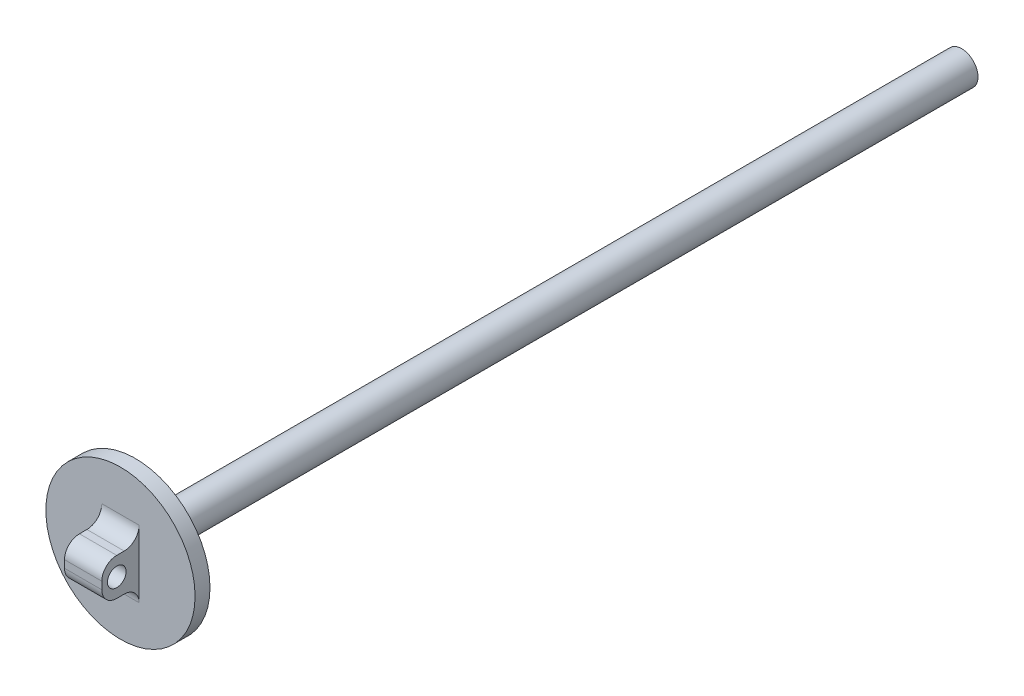
ISO-10303-21;
HEADER;
FILE_DESCRIPTION(('STEP AP214'),'2;1');
FILE_NAME('part.step','',(''),(''),'','','');
FILE_SCHEMA(('AUTOMOTIVE_DESIGN { 1 0 10303 214 1 1 1 1 }'));
ENDSEC;
DATA;
#1=APPLICATION_CONTEXT('core data for automotive mechanical design processes');
#2=APPLICATION_PROTOCOL_DEFINITION('international standard','automotive_design',2000,#1);
#3=PRODUCT_CONTEXT('',#1,'mechanical');
#4=PRODUCT('Part','Part','',(#3));
#5=PRODUCT_RELATED_PRODUCT_CATEGORY('part','',(#4));
#6=PRODUCT_DEFINITION_FORMATION('','',#4);
#7=PRODUCT_DEFINITION_CONTEXT('part definition',#1,'design');
#8=PRODUCT_DEFINITION('design','',#6,#7);
#9=PRODUCT_DEFINITION_SHAPE('','',#8);
#10=(LENGTH_UNIT() NAMED_UNIT(*) SI_UNIT(.MILLI.,.METRE.));
#11=(NAMED_UNIT(*) PLANE_ANGLE_UNIT() SI_UNIT($,.RADIAN.));
#12=(NAMED_UNIT(*) SI_UNIT($,.STERADIAN.) SOLID_ANGLE_UNIT());
#13=UNCERTAINTY_MEASURE_WITH_UNIT(LENGTH_MEASURE(1.E-05),#10,'distance_accuracy_value','');
#14=(GEOMETRIC_REPRESENTATION_CONTEXT(3) GLOBAL_UNCERTAINTY_ASSIGNED_CONTEXT((#13)) GLOBAL_UNIT_ASSIGNED_CONTEXT((#10,
#11,#12)) REPRESENTATION_CONTEXT('',''));
#15=CARTESIAN_POINT('',(0.,0.,0.));
#16=DIRECTION('',(0.,0.,1.));
#17=DIRECTION('',(1.,0.,0.));
#18=AXIS2_PLACEMENT_3D('',#15,#16,#17);
#19=CARTESIAN_POINT('',(0.,0.,547.37));
#20=DIRECTION('',(0.,0.,1.));
#21=DIRECTION('',(1.,0.,0.));
#22=AXIS2_PLACEMENT_3D('',#19,#20,#21);
#23=CYLINDRICAL_SURFACE('',#22,12.2616782014535);
#24=CARTESIAN_POINT('',(0.,0.,547.37));
#25=DIRECTION('',(0.,0.,1.));
#26=DIRECTION('',(1.,0.,0.));
#27=AXIS2_PLACEMENT_3D('',#24,#25,#26);
#28=CIRCLE('',#27,12.2616782014535);
#29=CARTESIAN_POINT('',(12.2616782014535,0.,547.37));
#30=VERTEX_POINT('',#29);
#31=EDGE_CURVE('E240',#30,#30,#28,.T.);
#32=ORIENTED_EDGE('',*,*,#31,.T.);
#33=EDGE_LOOP('',(#32));
#34=FACE_BOUND('',#33,.T.);
#35=CARTESIAN_POINT('',(0.,0.,562.61));
#36=DIRECTION('',(0.,0.,1.));
#37=DIRECTION('',(1.,0.,0.));
#38=AXIS2_PLACEMENT_3D('',#35,#36,#37);
#39=CIRCLE('',#38,12.2616782014535);
#40=CARTESIAN_POINT('',(12.2616782014535,0.,562.61));
#41=VERTEX_POINT('',#40);
#42=EDGE_CURVE('E170',#41,#41,#39,.F.);
#43=ORIENTED_EDGE('',*,*,#42,.T.);
#44=EDGE_LOOP('',(#43));
#45=FACE_BOUND('',#44,.T.);
#46=ADVANCED_FACE('F62',(#34,#45),#23,.T.);
#47=CARTESIAN_POINT('',(0.,0.,572.77));
#48=DIRECTION('',(0.,0.,-1.));
#49=DIRECTION('',(-1.,0.,0.));
#50=AXIS2_PLACEMENT_3D('',#47,#48,#49);
#51=CYLINDRICAL_SURFACE('',#50,11.1125);
#52=CARTESIAN_POINT('',(0.,0.,0.));
#53=DIRECTION('',(0.,0.,1.));
#54=DIRECTION('',(1.,0.,0.));
#55=AXIS2_PLACEMENT_3D('',#52,#53,#54);
#56=CIRCLE('',#55,11.1125);
#57=CARTESIAN_POINT('',(11.1125,0.,0.));
#58=VERTEX_POINT('',#57);
#59=EDGE_CURVE('E165',#58,#58,#56,.T.);
#60=ORIENTED_EDGE('',*,*,#59,.T.);
#61=EDGE_LOOP('',(#60));
#62=FACE_BOUND('',#61,.T.);
#63=CARTESIAN_POINT('',(0.,0.,547.37));
#64=DIRECTION('',(0.,0.,1.));
#65=DIRECTION('',(1.,0.,0.));
#66=AXIS2_PLACEMENT_3D('',#63,#64,#65);
#67=CIRCLE('',#66,11.1125);
#68=CARTESIAN_POINT('',(11.1125,0.,547.37));
#69=VERTEX_POINT('',#68);
#70=EDGE_CURVE('E156',#69,#69,#67,.T.);
#71=ORIENTED_EDGE('',*,*,#70,.F.);
#72=EDGE_LOOP('',(#71));
#73=FACE_BOUND('',#72,.T.);
#74=ADVANCED_FACE('F284',(#62,#73),#51,.T.);
#75=CARTESIAN_POINT('',(0.,0.,0.));
#76=DIRECTION('',(0.,0.,1.));
#77=DIRECTION('',(1.,0.,0.));
#78=AXIS2_PLACEMENT_3D('',#75,#76,#77);
#79=PLANE('',#78);
#80=ORIENTED_EDGE('',*,*,#59,.F.);
#81=EDGE_LOOP('',(#80));
#82=FACE_BOUND('',#81,.T.);
#83=ADVANCED_FACE('F292',(#82),#79,.F.);
#84=CARTESIAN_POINT('',(0.,0.,547.37));
#85=DIRECTION('',(0.,0.,1.));
#86=DIRECTION('',(1.,0.,0.));
#87=AXIS2_PLACEMENT_3D('',#84,#85,#86);
#88=PLANE('',#87);
#89=ORIENTED_EDGE('',*,*,#70,.T.);
#90=EDGE_LOOP('',(#89));
#91=FACE_BOUND('',#90,.T.);
#92=ORIENTED_EDGE('',*,*,#31,.F.);
#93=EDGE_LOOP('',(#92));
#94=FACE_BOUND('',#93,.T.);
#95=ADVANCED_FACE('F300',(#91,#94),#88,.F.);
#96=CARTESIAN_POINT('',(0.,0.,572.77));
#97=DIRECTION('',(0.,0.,1.));
#98=DIRECTION('',(1.,0.,0.));
#99=AXIS2_PLACEMENT_3D('',#96,#97,#98);
#100=PLANE('',#99);
#101=CARTESIAN_POINT('',(0.,0.,572.77));
#102=DIRECTION('',(0.,0.,1.));
#103=DIRECTION('',(1.,0.,0.));
#104=AXIS2_PLACEMENT_3D('',#101,#102,#103);
#105=CIRCLE('',#104,50.8);
#106=CARTESIAN_POINT('',(50.8,0.,572.77));
#107=VERTEX_POINT('',#106);
#108=EDGE_CURVE('E256',#107,#107,#105,.T.);
#109=ORIENTED_EDGE('',*,*,#108,.T.);
#110=EDGE_LOOP('',(#109));
#111=FACE_BOUND('',#110,.T.);
#112=DIRECTION('',(0.,1.,0.));
#113=VECTOR('',#112,1.);
#114=CARTESIAN_POINT('',(12.6999999999999,12.7,572.77));
#115=LINE('',#114,#113);
#116=CARTESIAN_POINT('',(12.7,-22.86,572.77));
#117=VERTEX_POINT('',#116);
#118=CARTESIAN_POINT('',(12.7,22.86,572.77));
#119=VERTEX_POINT('',#118);
#120=EDGE_CURVE('E217',#117,#119,#115,.T.);
#121=ORIENTED_EDGE('',*,*,#120,.F.);
#122=DIRECTION('',(1.,0.,0.));
#123=VECTOR('',#122,1.);
#124=CARTESIAN_POINT('',(0.,-22.86,572.77));
#125=LINE('',#124,#123);
#126=CARTESIAN_POINT('',(-12.7,-22.86,572.77));
#127=VERTEX_POINT('',#126);
#128=EDGE_CURVE('E173',#117,#127,#125,.F.);
#129=ORIENTED_EDGE('',*,*,#128,.T.);
#130=DIRECTION('',(0.,-1.,0.));
#131=VECTOR('',#130,1.);
#132=CARTESIAN_POINT('',(-12.7000000000001,12.7,572.77));
#133=LINE('',#132,#131);
#134=CARTESIAN_POINT('',(-12.7,22.8599999999999,572.77));
#135=VERTEX_POINT('',#134);
#136=EDGE_CURVE('E210',#135,#127,#133,.T.);
#137=ORIENTED_EDGE('',*,*,#136,.F.);
#138=DIRECTION('',(-1.,0.,0.));
#139=VECTOR('',#138,1.);
#140=CARTESIAN_POINT('',(0.,22.86,572.77));
#141=LINE('',#140,#139);
#142=EDGE_CURVE('E163',#135,#119,#141,.F.);
#143=ORIENTED_EDGE('',*,*,#142,.T.);
#144=EDGE_LOOP('',(#121,#129,#137,#143));
#145=FACE_BOUND('',#144,.T.);
#146=ADVANCED_FACE('F213',(#111,#145),#100,.T.);
#147=CARTESIAN_POINT('',(0.,0.,562.61));
#148=DIRECTION('',(0.,0.,1.));
#149=DIRECTION('',(1.,0.,0.));
#150=AXIS2_PLACEMENT_3D('',#147,#148,#149);
#151=CYLINDRICAL_SURFACE('',#150,50.8);
#152=CARTESIAN_POINT('',(0.,0.,562.61));
#153=DIRECTION('',(0.,0.,1.));
#154=DIRECTION('',(1.,0.,0.));
#155=AXIS2_PLACEMENT_3D('',#152,#153,#154);
#156=CIRCLE('',#155,50.8);
#157=CARTESIAN_POINT('',(50.8,0.,562.61));
#158=VERTEX_POINT('',#157);
#159=EDGE_CURVE('E260',#158,#158,#156,.T.);
#160=ORIENTED_EDGE('',*,*,#159,.T.);
#161=EDGE_LOOP('',(#160));
#162=FACE_BOUND('',#161,.T.);
#163=ORIENTED_EDGE('',*,*,#108,.F.);
#164=EDGE_LOOP('',(#163));
#165=FACE_BOUND('',#164,.T.);
#166=ADVANCED_FACE('F314',(#162,#165),#151,.T.);
#167=CARTESIAN_POINT('',(0.,0.,562.61));
#168=DIRECTION('',(0.,0.,1.));
#169=DIRECTION('',(1.,0.,0.));
#170=AXIS2_PLACEMENT_3D('',#167,#168,#169);
#171=PLANE('',#170);
#172=ORIENTED_EDGE('',*,*,#42,.F.);
#173=EDGE_LOOP('',(#172));
#174=FACE_BOUND('',#173,.T.);
#175=ORIENTED_EDGE('',*,*,#159,.F.);
#176=EDGE_LOOP('',(#175));
#177=FACE_BOUND('',#176,.T.);
#178=ADVANCED_FACE('F322',(#174,#177),#171,.F.);
#179=CARTESIAN_POINT('',(-38.1,0.,588.01));
#180=DIRECTION('',(1.,0.,0.));
#181=DIRECTION('',(0.,1.,0.));
#182=AXIS2_PLACEMENT_3D('',#179,#180,#181);
#183=CYLINDRICAL_SURFACE('',#182,6.34999999999994);
#184=CARTESIAN_POINT('',(12.7,0.,588.01));
#185=DIRECTION('',(1.,0.,0.));
#186=DIRECTION('',(0.,1.,0.));
#187=AXIS2_PLACEMENT_3D('',#184,#185,#186);
#188=CIRCLE('',#187,6.34999999999994);
#189=CARTESIAN_POINT('',(12.7,6.34999999999995,588.01));
#190=VERTEX_POINT('',#189);
#191=EDGE_CURVE('E244',#190,#190,#188,.T.);
#192=CARTESIAN_POINT('',(-12.7,0.,588.01));
#193=DIRECTION('',(1.,0.,0.));
#194=DIRECTION('',(0.,1.,0.));
#195=AXIS2_PLACEMENT_3D('',#192,#193,#194);
#196=CIRCLE('',#195,6.34999999999994);
#197=CARTESIAN_POINT('',(-12.7,6.34999999999994,588.01));
#198=VERTEX_POINT('',#197);
#199=EDGE_CURVE('E225',#198,#198,#196,.T.);
#200=CARTESIAN_POINT('',(12.7,6.34999999999995,588.01));
#201=CARTESIAN_POINT('',(12.4354166666666,6.34999999999995,588.01));
#202=CARTESIAN_POINT('',(12.1708333333333,6.34999999999995,588.01));
#203=CARTESIAN_POINT('',(11.6416666666666,6.34999999999995,588.01));
#204=CARTESIAN_POINT('',(11.3770833333333,6.34999999999995,588.01));
#205=CARTESIAN_POINT('',(10.8479166666666,6.34999999999995,588.01));
#206=CARTESIAN_POINT('',(10.5833333333333,6.34999999999995,588.01));
#207=CARTESIAN_POINT('',(10.0541666666666,6.34999999999995,588.01));
#208=CARTESIAN_POINT('',(9.78958333333331,6.34999999999995,588.01));
#209=CARTESIAN_POINT('',(9.26041666666664,6.34999999999995,588.01));
#210=CARTESIAN_POINT('',(8.99583333333331,6.34999999999995,588.01));
#211=CARTESIAN_POINT('',(8.46666666666664,6.34999999999995,588.01));
#212=CARTESIAN_POINT('',(8.20208333333331,6.34999999999995,588.01));
#213=CARTESIAN_POINT('',(7.67291666666664,6.34999999999995,588.01));
#214=CARTESIAN_POINT('',(7.40833333333331,6.34999999999995,588.01));
#215=CARTESIAN_POINT('',(6.87916666666664,6.34999999999995,588.01));
#216=CARTESIAN_POINT('',(6.61458333333331,6.34999999999995,588.01));
#217=CARTESIAN_POINT('',(6.08541666666664,6.34999999999995,588.01));
#218=CARTESIAN_POINT('',(5.82083333333331,6.34999999999995,588.01));
#219=CARTESIAN_POINT('',(5.29166666666664,6.34999999999995,588.01));
#220=CARTESIAN_POINT('',(5.0270833333333,6.34999999999995,588.01));
#221=CARTESIAN_POINT('',(4.49791666666664,6.34999999999995,588.01));
#222=CARTESIAN_POINT('',(4.2333333333333,6.34999999999995,588.01));
#223=CARTESIAN_POINT('',(3.70416666666664,6.34999999999995,588.01));
#224=CARTESIAN_POINT('',(3.4395833333333,6.34999999999995,588.01));
#225=CARTESIAN_POINT('',(2.91041666666664,6.34999999999995,588.01));
#226=CARTESIAN_POINT('',(2.6458333333333,6.34999999999995,588.01));
#227=CARTESIAN_POINT('',(2.11666666666663,6.34999999999995,588.01));
#228=CARTESIAN_POINT('',(1.8520833333333,6.34999999999995,588.01));
#229=CARTESIAN_POINT('',(1.32291666666664,6.34999999999995,588.01));
#230=CARTESIAN_POINT('',(1.0583333333333,6.34999999999995,588.01));
#231=CARTESIAN_POINT('',(0.529166666666634,6.34999999999995,588.01));
#232=CARTESIAN_POINT('',(0.2645833333333,6.34999999999995,588.01));
#233=CARTESIAN_POINT('',(-0.264583333333369,6.34999999999995,588.01));
#234=CARTESIAN_POINT('',(-0.529166666666703,6.34999999999995,588.01));
#235=CARTESIAN_POINT('',(-1.05833333333337,6.34999999999995,588.01));
#236=CARTESIAN_POINT('',(-1.32291666666671,6.34999999999995,588.01));
#237=CARTESIAN_POINT('',(-1.85208333333337,6.34999999999995,588.01));
#238=CARTESIAN_POINT('',(-2.1166666666667,6.34999999999995,588.01));
#239=CARTESIAN_POINT('',(-2.64583333333337,6.34999999999995,588.01));
#240=CARTESIAN_POINT('',(-2.9104166666667,6.34999999999995,588.01));
#241=CARTESIAN_POINT('',(-3.43958333333337,6.34999999999995,588.01));
#242=CARTESIAN_POINT('',(-3.70416666666671,6.34999999999995,588.01));
#243=CARTESIAN_POINT('',(-4.23333333333337,6.34999999999995,588.01));
#244=CARTESIAN_POINT('',(-4.49791666666671,6.34999999999995,588.01));
#245=CARTESIAN_POINT('',(-5.02708333333337,6.34999999999995,588.01));
#246=CARTESIAN_POINT('',(-5.29166666666671,6.34999999999995,588.01));
#247=CARTESIAN_POINT('',(-5.82083333333337,6.34999999999995,588.01));
#248=CARTESIAN_POINT('',(-6.08541666666671,6.34999999999995,588.01));
#249=CARTESIAN_POINT('',(-6.61458333333338,6.34999999999995,588.01));
#250=CARTESIAN_POINT('',(-6.87916666666671,6.34999999999995,588.01));
#251=CARTESIAN_POINT('',(-7.40833333333337,6.34999999999995,588.01));
#252=CARTESIAN_POINT('',(-7.67291666666671,6.34999999999995,588.01));
#253=CARTESIAN_POINT('',(-8.20208333333338,6.34999999999995,588.01));
#254=CARTESIAN_POINT('',(-8.46666666666671,6.34999999999995,588.01));
#255=CARTESIAN_POINT('',(-8.99583333333337,6.34999999999995,588.01));
#256=CARTESIAN_POINT('',(-9.26041666666671,6.34999999999994,588.01));
#257=CARTESIAN_POINT('',(-9.78958333333338,6.34999999999994,588.01));
#258=CARTESIAN_POINT('',(-10.0541666666667,6.34999999999994,588.01));
#259=CARTESIAN_POINT('',(-10.5833333333334,6.34999999999994,588.01));
#260=CARTESIAN_POINT('',(-10.8479166666667,6.34999999999994,588.01));
#261=CARTESIAN_POINT('',(-11.3770833333334,6.34999999999994,588.01));
#262=CARTESIAN_POINT('',(-11.6416666666667,6.34999999999994,588.01));
#263=CARTESIAN_POINT('',(-12.1708333333334,6.34999999999994,588.01));
#264=CARTESIAN_POINT('',(-12.4354166666667,6.34999999999994,588.01));
#265=CARTESIAN_POINT('',(-12.7,6.34999999999994,588.01));
#266=B_SPLINE_CURVE_WITH_KNOTS('',3,(#200,#201,#202,#203,#204,#205,#206,#207,#208,#209,#210,
#211,#212,#213,#214,#215,#216,#217,#218,#219,#220,#221,#222,#223,#224,#225,#226,#227,#228,#229,
#230,#231,#232,#233,#234,#235,#236,#237,#238,#239,#240,#241,#242,#243,#244,#245,#246,#247,#248,
#249,#250,#251,#252,#253,#254,#255,#256,#257,#258,#259,#260,#261,#262,#263,#264,#265),
.UNSPECIFIED.,.F.,.F.,(4,2,2,2,2,2,2,2,2,2,2,2,2,2,2,2,2,2,2,2,2,2,2,2,2,2,2,2,2,2,2,2,4),(0.,
0.793750000000003,1.58750000000001,2.38125,3.175,3.96875000000001,4.7625,5.55625000000001,
6.35000000000001,7.14375000000001,7.93750000000001,8.73125000000001,9.52500000000001,10.31875,
11.1125,11.90625,12.7,13.49375,14.2875,15.08125,15.875,16.66875,17.4625,18.25625,19.05,19.84375,
20.6375,21.43125,22.225,23.01875,23.8125,24.60625,25.4),.UNSPECIFIED.);
#267=EDGE_CURVE('BSEAM330',#190,#198,#266,.T.);
#268=ORIENTED_EDGE('',*,*,#191,.T.);
#269=ORIENTED_EDGE('',*,*,#199,.F.);
#270=ORIENTED_EDGE('',*,*,#267,.T.);
#271=ORIENTED_EDGE('',*,*,#267,.F.);
#272=EDGE_LOOP('',(#268,#270,#269,#271));
#273=FACE_BOUND('',#272,.T.);
#274=ADVANCED_FACE('F330',(#273),#183,.F.);
#275=CARTESIAN_POINT('',(0.,0.,598.17));
#276=DIRECTION('',(0.,0.,1.));
#277=DIRECTION('',(1.,0.,0.));
#278=AXIS2_PLACEMENT_3D('',#275,#276,#277);
#279=PLANE('',#278);
#280=DIRECTION('',(0.,1.,0.));
#281=VECTOR('',#280,1.);
#282=CARTESIAN_POINT('',(12.6999999999999,12.7,598.17));
#283=LINE('',#282,#281);
#284=CARTESIAN_POINT('',(12.7,-2.53999999999999,598.17));
#285=VERTEX_POINT('',#284);
#286=CARTESIAN_POINT('',(12.7,2.53999999999999,598.17));
#287=VERTEX_POINT('',#286);
#288=EDGE_CURVE('E136',#285,#287,#283,.T.);
#289=ORIENTED_EDGE('',*,*,#288,.T.);
#290=DIRECTION('',(-1.,0.,0.));
#291=VECTOR('',#290,1.);
#292=CARTESIAN_POINT('',(-12.7,2.53999999999999,598.17));
#293=LINE('',#292,#291);
#294=CARTESIAN_POINT('',(-12.7,2.53999999999999,598.17));
#295=VERTEX_POINT('',#294);
#296=EDGE_CURVE('E190',#287,#295,#293,.T.);
#297=ORIENTED_EDGE('',*,*,#296,.T.);
#298=DIRECTION('',(0.,-1.,0.));
#299=VECTOR('',#298,1.);
#300=CARTESIAN_POINT('',(-12.7000000000001,12.7,598.17));
#301=LINE('',#300,#299);
#302=CARTESIAN_POINT('',(-12.7,-2.53999999999999,598.17));
#303=VERTEX_POINT('',#302);
#304=EDGE_CURVE('E153',#295,#303,#301,.T.);
#305=ORIENTED_EDGE('',*,*,#304,.T.);
#306=DIRECTION('',(1.,0.,0.));
#307=VECTOR('',#306,1.);
#308=CARTESIAN_POINT('',(12.6999999999999,-2.54000000000004,598.17));
#309=LINE('',#308,#307);
#310=EDGE_CURVE('E183',#303,#285,#309,.T.);
#311=ORIENTED_EDGE('',*,*,#310,.T.);
#312=EDGE_LOOP('',(#289,#297,#305,#311));
#313=FACE_BOUND('',#312,.T.);
#314=ADVANCED_FACE('F264',(#313),#279,.T.);
#315=CARTESIAN_POINT('',(-12.7,-12.7,598.17));
#316=DIRECTION('',(0.,1.,0.));
#317=DIRECTION('',(0.,0.,1.));
#318=AXIS2_PLACEMENT_3D('',#315,#316,#317);
#319=PLANE('',#318);
#320=DIRECTION('',(0.,0.,-1.));
#321=VECTOR('',#320,1.);
#322=CARTESIAN_POINT('',(-12.7,-12.7,598.17));
#323=LINE('',#322,#321);
#324=CARTESIAN_POINT('',(-12.7,-12.7,588.01));
#325=VERTEX_POINT('',#324);
#326=CARTESIAN_POINT('',(-12.7,-12.7,582.93));
#327=VERTEX_POINT('',#326);
#328=EDGE_CURVE('E155',#325,#327,#323,.T.);
#329=ORIENTED_EDGE('',*,*,#328,.T.);
#330=DIRECTION('',(1.,0.,0.));
#331=VECTOR('',#330,1.);
#332=CARTESIAN_POINT('',(-12.7,-12.7,582.93));
#333=LINE('',#332,#331);
#334=CARTESIAN_POINT('',(12.7,-12.7,582.93));
#335=VERTEX_POINT('',#334);
#336=EDGE_CURVE('E148',#327,#335,#333,.T.);
#337=ORIENTED_EDGE('',*,*,#336,.T.);
#338=DIRECTION('',(0.,0.,-1.));
#339=VECTOR('',#338,1.);
#340=CARTESIAN_POINT('',(12.7,-12.7,598.17));
#341=LINE('',#340,#339);
#342=CARTESIAN_POINT('',(12.7,-12.7,588.01));
#343=VERTEX_POINT('',#342);
#344=EDGE_CURVE('E134',#343,#335,#341,.T.);
#345=ORIENTED_EDGE('',*,*,#344,.F.);
#346=DIRECTION('',(1.,0.,0.));
#347=VECTOR('',#346,1.);
#348=CARTESIAN_POINT('',(-12.7,-12.7,588.01));
#349=LINE('',#348,#347);
#350=EDGE_CURVE('E149',#343,#325,#349,.F.);
#351=ORIENTED_EDGE('',*,*,#350,.T.);
#352=EDGE_LOOP('',(#329,#337,#345,#351));
#353=FACE_BOUND('',#352,.T.);
#354=ADVANCED_FACE('F150',(#353),#319,.F.);
#355=CARTESIAN_POINT('',(-12.7000000000001,12.7,598.17));
#356=DIRECTION('',(1.,0.,0.));
#357=DIRECTION('',(0.,1.,0.));
#358=AXIS2_PLACEMENT_3D('',#355,#356,#357);
#359=PLANE('',#358);
#360=ORIENTED_EDGE('',*,*,#199,.T.);
#361=EDGE_LOOP('',(#360));
#362=FACE_BOUND('',#361,.T.);
#363=ORIENTED_EDGE('',*,*,#304,.F.);
#364=CARTESIAN_POINT('',(-12.7,2.53999999999999,588.01));
#365=DIRECTION('',(1.,0.,0.));
#366=DIRECTION('',(0.,1.,0.));
#367=AXIS2_PLACEMENT_3D('',#364,#365,#366);
#368=CIRCLE('',#367,10.16);
#369=CARTESIAN_POINT('',(-12.7000000000001,12.7,588.01));
#370=VERTEX_POINT('',#369);
#371=EDGE_CURVE('E83',#295,#370,#368,.F.);
#372=ORIENTED_EDGE('',*,*,#371,.T.);
#373=DIRECTION('',(0.,0.,-1.));
#374=VECTOR('',#373,1.);
#375=CARTESIAN_POINT('',(-12.7000000000001,12.7,598.17));
#376=LINE('',#375,#374);
#377=CARTESIAN_POINT('',(-12.7000000000001,12.7,582.93));
#378=VERTEX_POINT('',#377);
#379=EDGE_CURVE('E209',#370,#378,#376,.T.);
#380=ORIENTED_EDGE('',*,*,#379,.T.);
#381=CARTESIAN_POINT('',(-12.7,22.8599999999999,582.93));
#382=DIRECTION('',(1.,0.,0.));
#383=DIRECTION('',(0.,1.,0.));
#384=AXIS2_PLACEMENT_3D('',#381,#382,#383);
#385=CIRCLE('',#384,10.16);
#386=EDGE_CURVE('E66',#378,#135,#385,.T.);
#387=ORIENTED_EDGE('',*,*,#386,.T.);
#388=ORIENTED_EDGE('',*,*,#136,.T.);
#389=CARTESIAN_POINT('',(-12.7,-22.86,582.93));
#390=DIRECTION('',(1.,0.,0.));
#391=DIRECTION('',(0.,1.,0.));
#392=AXIS2_PLACEMENT_3D('',#389,#390,#391);
#393=CIRCLE('',#392,10.16);
#394=EDGE_CURVE('E199',#127,#327,#393,.T.);
#395=ORIENTED_EDGE('',*,*,#394,.T.);
#396=ORIENTED_EDGE('',*,*,#328,.F.);
#397=CARTESIAN_POINT('',(-12.7,-2.54000000000004,588.01));
#398=DIRECTION('',(1.,0.,0.));
#399=DIRECTION('',(0.,1.,0.));
#400=AXIS2_PLACEMENT_3D('',#397,#398,#399);
#401=CIRCLE('',#400,10.16);
#402=EDGE_CURVE('E80',#325,#303,#401,.F.);
#403=ORIENTED_EDGE('',*,*,#402,.T.);
#404=EDGE_LOOP('',(#363,#372,#380,#387,#388,#395,#396,#403));
#405=FACE_BOUND('',#404,.T.);
#406=ADVANCED_FACE('F207',(#362,#405),#359,.F.);
#407=CARTESIAN_POINT('',(-12.7000000000001,12.7,598.17));
#408=DIRECTION('',(0.,-1.,0.));
#409=DIRECTION('',(0.,0.,-1.));
#410=AXIS2_PLACEMENT_3D('',#407,#408,#409);
#411=PLANE('',#410);
#412=DIRECTION('',(0.,0.,-1.));
#413=VECTOR('',#412,1.);
#414=CARTESIAN_POINT('',(12.6999999999999,12.7,598.17));
#415=LINE('',#414,#413);
#416=CARTESIAN_POINT('',(12.6999999999999,12.7,588.01));
#417=VERTEX_POINT('',#416);
#418=CARTESIAN_POINT('',(12.6999999999999,12.7,582.93));
#419=VERTEX_POINT('',#418);
#420=EDGE_CURVE('E231',#417,#419,#415,.T.);
#421=ORIENTED_EDGE('',*,*,#420,.T.);
#422=DIRECTION('',(-1.,0.,0.));
#423=VECTOR('',#422,1.);
#424=CARTESIAN_POINT('',(-12.7000000000001,12.7,582.93));
#425=LINE('',#424,#423);
#426=EDGE_CURVE('E179',#419,#378,#425,.T.);
#427=ORIENTED_EDGE('',*,*,#426,.T.);
#428=ORIENTED_EDGE('',*,*,#379,.F.);
#429=DIRECTION('',(-1.,0.,0.));
#430=VECTOR('',#429,1.);
#431=CARTESIAN_POINT('',(12.6999999999999,12.7,588.01));
#432=LINE('',#431,#430);
#433=EDGE_CURVE('E180',#370,#417,#432,.F.);
#434=ORIENTED_EDGE('',*,*,#433,.T.);
#435=EDGE_LOOP('',(#421,#427,#428,#434));
#436=FACE_BOUND('',#435,.T.);
#437=ADVANCED_FACE('F266',(#436),#411,.F.);
#438=CARTESIAN_POINT('',(12.6999999999999,12.7,598.17));
#439=DIRECTION('',(-1.,0.,0.));
#440=DIRECTION('',(0.,-1.,0.));
#441=AXIS2_PLACEMENT_3D('',#438,#439,#440);
#442=PLANE('',#441);
#443=ORIENTED_EDGE('',*,*,#191,.F.);
#444=EDGE_LOOP('',(#443));
#445=FACE_BOUND('',#444,.T.);
#446=ORIENTED_EDGE('',*,*,#420,.F.);
#447=CARTESIAN_POINT('',(12.7,2.53999999999999,588.01));
#448=DIRECTION('',(-1.,0.,0.));
#449=DIRECTION('',(0.,-1.,0.));
#450=AXIS2_PLACEMENT_3D('',#447,#448,#449);
#451=CIRCLE('',#450,10.16);
#452=EDGE_CURVE('E145',#417,#287,#451,.F.);
#453=ORIENTED_EDGE('',*,*,#452,.T.);
#454=ORIENTED_EDGE('',*,*,#288,.F.);
#455=CARTESIAN_POINT('',(12.6999999999999,-2.54000000000004,588.01));
#456=DIRECTION('',(-1.,0.,0.));
#457=DIRECTION('',(0.,-1.,0.));
#458=AXIS2_PLACEMENT_3D('',#455,#456,#457);
#459=CIRCLE('',#458,10.16);
#460=EDGE_CURVE('E126',#285,#343,#459,.F.);
#461=ORIENTED_EDGE('',*,*,#460,.T.);
#462=ORIENTED_EDGE('',*,*,#344,.T.);
#463=CARTESIAN_POINT('',(12.7,-22.86,582.93));
#464=DIRECTION('',(-1.,0.,0.));
#465=DIRECTION('',(0.,-1.,0.));
#466=AXIS2_PLACEMENT_3D('',#463,#464,#465);
#467=CIRCLE('',#466,10.16);
#468=EDGE_CURVE('E197',#335,#117,#467,.T.);
#469=ORIENTED_EDGE('',*,*,#468,.T.);
#470=ORIENTED_EDGE('',*,*,#120,.T.);
#471=CARTESIAN_POINT('',(12.7,22.86,582.93));
#472=DIRECTION('',(-1.,0.,0.));
#473=DIRECTION('',(0.,-1.,0.));
#474=AXIS2_PLACEMENT_3D('',#471,#472,#473);
#475=CIRCLE('',#474,10.16);
#476=EDGE_CURVE('E13',#119,#419,#475,.T.);
#477=ORIENTED_EDGE('',*,*,#476,.T.);
#478=EDGE_LOOP('',(#446,#453,#454,#461,#462,#469,#470,#477));
#479=FACE_BOUND('',#478,.T.);
#480=ADVANCED_FACE('F135',(#445,#479),#442,.F.);
#481=CARTESIAN_POINT('',(-12.7,-22.86,582.93));
#482=DIRECTION('',(1.,0.,0.));
#483=DIRECTION('',(0.,0.,-1.));
#484=AXIS2_PLACEMENT_3D('',#481,#482,#483);
#485=CYLINDRICAL_SURFACE('',#484,10.16);
#486=ORIENTED_EDGE('',*,*,#394,.F.);
#487=ORIENTED_EDGE('',*,*,#128,.F.);
#488=ORIENTED_EDGE('',*,*,#468,.F.);
#489=ORIENTED_EDGE('',*,*,#336,.F.);
#490=EDGE_LOOP('',(#486,#487,#488,#489));
#491=FACE_BOUND('',#490,.T.);
#492=ADVANCED_FACE('F270',(#491),#485,.F.);
#493=CARTESIAN_POINT('',(-12.7,22.8599999999999,582.93));
#494=DIRECTION('',(-1.,0.,0.));
#495=DIRECTION('',(0.,0.,1.));
#496=AXIS2_PLACEMENT_3D('',#493,#494,#495);
#497=CYLINDRICAL_SURFACE('',#496,10.16);
#498=ORIENTED_EDGE('',*,*,#476,.F.);
#499=ORIENTED_EDGE('',*,*,#142,.F.);
#500=ORIENTED_EDGE('',*,*,#386,.F.);
#501=ORIENTED_EDGE('',*,*,#426,.F.);
#502=EDGE_LOOP('',(#498,#499,#500,#501));
#503=FACE_BOUND('',#502,.T.);
#504=ADVANCED_FACE('F214',(#503),#497,.F.);
#505=CARTESIAN_POINT('',(0.,2.53999999999999,588.01));
#506=DIRECTION('',(1.,0.,0.));
#507=DIRECTION('',(0.,0.,-1.));
#508=AXIS2_PLACEMENT_3D('',#505,#506,#507);
#509=CYLINDRICAL_SURFACE('',#508,10.16);
#510=ORIENTED_EDGE('',*,*,#452,.F.);
#511=ORIENTED_EDGE('',*,*,#433,.F.);
#512=ORIENTED_EDGE('',*,*,#371,.F.);
#513=ORIENTED_EDGE('',*,*,#296,.F.);
#514=EDGE_LOOP('',(#510,#511,#512,#513));
#515=FACE_BOUND('',#514,.T.);
#516=ADVANCED_FACE('F269',(#515),#509,.T.);
#517=CARTESIAN_POINT('',(0.,-2.53999999999999,588.01));
#518=DIRECTION('',(-1.,0.,0.));
#519=DIRECTION('',(0.,0.,1.));
#520=AXIS2_PLACEMENT_3D('',#517,#518,#519);
#521=CYLINDRICAL_SURFACE('',#520,10.16);
#522=ORIENTED_EDGE('',*,*,#402,.F.);
#523=ORIENTED_EDGE('',*,*,#350,.F.);
#524=ORIENTED_EDGE('',*,*,#460,.F.);
#525=ORIENTED_EDGE('',*,*,#310,.F.);
#526=EDGE_LOOP('',(#522,#523,#524,#525));
#527=FACE_BOUND('',#526,.T.);
#528=ADVANCED_FACE('F64',(#527),#521,.T.);
#529=CLOSED_SHELL('',(#46,#74,#83,#95,#146,#166,#178,#274,#314,#354,#406,#437,#480,#492,#504,
#516,#528));
#530=MANIFOLD_SOLID_BREP('B2',#529);
#531=ADVANCED_BREP_SHAPE_REPRESENTATION('',(#18,#530),#14);
#532=SHAPE_DEFINITION_REPRESENTATION(#9,#531);
ENDSEC;
END-ISO-10303-21;
